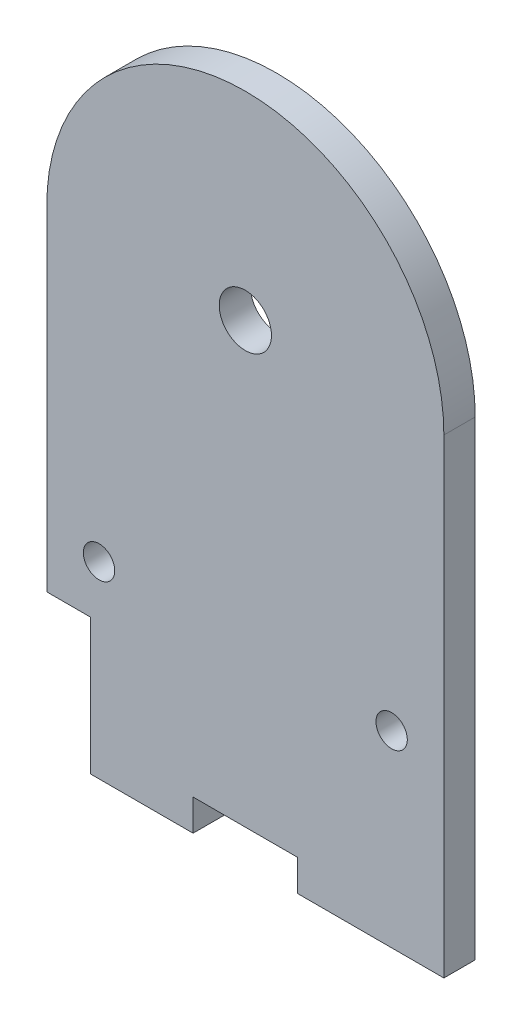
ISO-10303-21;
HEADER;
FILE_DESCRIPTION(('STEP AP214'),'2;1');
FILE_NAME('part.step','',(''),(''),'','','');
FILE_SCHEMA(('AUTOMOTIVE_DESIGN { 1 0 10303 214 1 1 1 1 }'));
ENDSEC;
DATA;
#1=APPLICATION_CONTEXT('core data for automotive mechanical design processes');
#2=APPLICATION_PROTOCOL_DEFINITION('international standard','automotive_design',2000,#1);
#3=PRODUCT_CONTEXT('',#1,'mechanical');
#4=PRODUCT('Part','Part','',(#3));
#5=PRODUCT_RELATED_PRODUCT_CATEGORY('part','',(#4));
#6=PRODUCT_DEFINITION_FORMATION('','',#4);
#7=PRODUCT_DEFINITION_CONTEXT('part definition',#1,'design');
#8=PRODUCT_DEFINITION('design','',#6,#7);
#9=PRODUCT_DEFINITION_SHAPE('','',#8);
#10=(LENGTH_UNIT() NAMED_UNIT(*) SI_UNIT(.MILLI.,.METRE.));
#11=(NAMED_UNIT(*) PLANE_ANGLE_UNIT() SI_UNIT($,.RADIAN.));
#12=(NAMED_UNIT(*) SI_UNIT($,.STERADIAN.) SOLID_ANGLE_UNIT());
#13=UNCERTAINTY_MEASURE_WITH_UNIT(LENGTH_MEASURE(1.E-05),#10,'distance_accuracy_value','');
#14=(GEOMETRIC_REPRESENTATION_CONTEXT(3) GLOBAL_UNCERTAINTY_ASSIGNED_CONTEXT((#13)) GLOBAL_UNIT_ASSIGNED_CONTEXT((#10,
#11,#12)) REPRESENTATION_CONTEXT('',''));
#15=CARTESIAN_POINT('',(0.,0.,0.));
#16=DIRECTION('',(0.,0.,1.));
#17=DIRECTION('',(1.,0.,0.));
#18=AXIS2_PLACEMENT_3D('',#15,#16,#17);
#19=CARTESIAN_POINT('',(0.,0.,3.));
#20=DIRECTION('',(0.,0.,1.));
#21=DIRECTION('',(1.,0.,0.));
#22=AXIS2_PLACEMENT_3D('',#19,#20,#21);
#23=PLANE('',#22);
#24=CARTESIAN_POINT('',(-14.,-27.,3.));
#25=DIRECTION('',(0.,0.,1.));
#26=DIRECTION('',(1.,0.,0.));
#27=AXIS2_PLACEMENT_3D('',#24,#25,#26);
#28=CIRCLE('',#27,1.5);
#29=CARTESIAN_POINT('',(-12.5,-27.,3.));
#30=VERTEX_POINT('',#29);
#31=EDGE_CURVE('E211',#30,#30,#28,.T.);
#32=ORIENTED_EDGE('',*,*,#31,.F.);
#33=EDGE_LOOP('',(#32));
#34=FACE_BOUND('',#33,.T.);
#35=CARTESIAN_POINT('',(0.,0.,3.));
#36=DIRECTION('',(0.,0.,1.));
#37=DIRECTION('',(1.,0.,0.));
#38=AXIS2_PLACEMENT_3D('',#35,#36,#37);
#39=CIRCLE('',#38,19.);
#40=CARTESIAN_POINT('',(19.,0.,3.));
#41=VERTEX_POINT('',#40);
#42=CARTESIAN_POINT('',(-19.,0.,3.));
#43=VERTEX_POINT('',#42);
#44=EDGE_CURVE('E160',#41,#43,#39,.T.);
#45=ORIENTED_EDGE('',*,*,#44,.T.);
#46=DIRECTION('',(0.,-1.,0.));
#47=VECTOR('',#46,1.);
#48=CARTESIAN_POINT('',(-19.,0.,3.));
#49=LINE('',#48,#47);
#50=CARTESIAN_POINT('',(-19.,-32.,3.));
#51=VERTEX_POINT('',#50);
#52=EDGE_CURVE('E98',#43,#51,#49,.T.);
#53=ORIENTED_EDGE('',*,*,#52,.T.);
#54=DIRECTION('',(1.,0.,0.));
#55=VECTOR('',#54,1.);
#56=CARTESIAN_POINT('',(-19.,-32.,3.));
#57=LINE('',#56,#55);
#58=CARTESIAN_POINT('',(-14.8,-32.,3.));
#59=VERTEX_POINT('',#58);
#60=EDGE_CURVE('E181',#51,#59,#57,.T.);
#61=ORIENTED_EDGE('',*,*,#60,.T.);
#62=DIRECTION('',(0.,-1.,0.));
#63=VECTOR('',#62,1.);
#64=CARTESIAN_POINT('',(-14.8,-32.,3.));
#65=LINE('',#64,#63);
#66=CARTESIAN_POINT('',(-14.8,-45.,3.));
#67=VERTEX_POINT('',#66);
#68=EDGE_CURVE('E200',#59,#67,#65,.T.);
#69=ORIENTED_EDGE('',*,*,#68,.T.);
#70=DIRECTION('',(1.,0.,0.));
#71=VECTOR('',#70,1.);
#72=CARTESIAN_POINT('',(-14.8,-45.,3.));
#73=LINE('',#72,#71);
#74=CARTESIAN_POINT('',(-4.99999999999999,-45.,3.));
#75=VERTEX_POINT('',#74);
#76=EDGE_CURVE('E197',#67,#75,#73,.T.);
#77=ORIENTED_EDGE('',*,*,#76,.T.);
#78=DIRECTION('',(0.,1.,0.));
#79=VECTOR('',#78,1.);
#80=CARTESIAN_POINT('',(-4.99999999999999,-42.,3.));
#81=LINE('',#80,#79);
#82=CARTESIAN_POINT('',(-4.99999999999999,-42.,3.));
#83=VERTEX_POINT('',#82);
#84=EDGE_CURVE('E199',#75,#83,#81,.T.);
#85=ORIENTED_EDGE('',*,*,#84,.T.);
#86=DIRECTION('',(1.,0.,0.));
#87=VECTOR('',#86,1.);
#88=CARTESIAN_POINT('',(5.,-42.,3.));
#89=LINE('',#88,#87);
#90=CARTESIAN_POINT('',(5.,-42.,3.));
#91=VERTEX_POINT('',#90);
#92=EDGE_CURVE('E123',#83,#91,#89,.T.);
#93=ORIENTED_EDGE('',*,*,#92,.T.);
#94=DIRECTION('',(0.,-1.,0.));
#95=VECTOR('',#94,1.);
#96=CARTESIAN_POINT('',(5.,-42.,3.));
#97=LINE('',#96,#95);
#98=CARTESIAN_POINT('',(5.,-45.,3.));
#99=VERTEX_POINT('',#98);
#100=EDGE_CURVE('E117',#91,#99,#97,.T.);
#101=ORIENTED_EDGE('',*,*,#100,.T.);
#102=DIRECTION('',(1.,0.,0.));
#103=VECTOR('',#102,1.);
#104=CARTESIAN_POINT('',(5.,-45.,3.));
#105=LINE('',#104,#103);
#106=CARTESIAN_POINT('',(19.,-45.,3.));
#107=VERTEX_POINT('',#106);
#108=EDGE_CURVE('E121',#99,#107,#105,.T.);
#109=ORIENTED_EDGE('',*,*,#108,.T.);
#110=DIRECTION('',(0.,1.,0.));
#111=VECTOR('',#110,1.);
#112=CARTESIAN_POINT('',(19.,-45.,3.));
#113=LINE('',#112,#111);
#114=EDGE_CURVE('E49',#107,#41,#113,.T.);
#115=ORIENTED_EDGE('',*,*,#114,.T.);
#116=EDGE_LOOP('',(#45,#53,#61,#69,#77,#85,#93,#101,#109,#115));
#117=FACE_BOUND('',#116,.T.);
#118=CARTESIAN_POINT('',(0.,0.,3.));
#119=DIRECTION('',(0.,0.,1.));
#120=DIRECTION('',(1.,0.,0.));
#121=AXIS2_PLACEMENT_3D('',#118,#119,#120);
#122=CIRCLE('',#121,2.5);
#123=CARTESIAN_POINT('',(2.5,0.,3.));
#124=VERTEX_POINT('',#123);
#125=EDGE_CURVE('E145',#124,#124,#122,.T.);
#126=ORIENTED_EDGE('',*,*,#125,.F.);
#127=EDGE_LOOP('',(#126));
#128=FACE_BOUND('',#127,.T.);
#129=CARTESIAN_POINT('',(14.,-27.,3.));
#130=DIRECTION('',(0.,0.,1.));
#131=DIRECTION('',(-1.,0.,0.));
#132=AXIS2_PLACEMENT_3D('',#129,#130,#131);
#133=CIRCLE('',#132,1.5);
#134=CARTESIAN_POINT('',(12.5,-27.,3.));
#135=VERTEX_POINT('',#134);
#136=EDGE_CURVE('E217',#135,#135,#133,.T.);
#137=ORIENTED_EDGE('',*,*,#136,.F.);
#138=EDGE_LOOP('',(#137));
#139=FACE_BOUND('',#138,.T.);
#140=ADVANCED_FACE('F32',(#34,#117,#128,#139),#23,.T.);
#141=CARTESIAN_POINT('',(0.,0.,0.));
#142=DIRECTION('',(0.,0.,1.));
#143=DIRECTION('',(1.,0.,0.));
#144=AXIS2_PLACEMENT_3D('',#141,#142,#143);
#145=PLANE('',#144);
#146=CARTESIAN_POINT('',(-14.,-27.,0.));
#147=DIRECTION('',(0.,0.,1.));
#148=DIRECTION('',(1.,0.,0.));
#149=AXIS2_PLACEMENT_3D('',#146,#147,#148);
#150=CIRCLE('',#149,1.5);
#151=CARTESIAN_POINT('',(-12.5,-27.,0.));
#152=VERTEX_POINT('',#151);
#153=EDGE_CURVE('E214',#152,#152,#150,.T.);
#154=ORIENTED_EDGE('',*,*,#153,.T.);
#155=EDGE_LOOP('',(#154));
#156=FACE_BOUND('',#155,.T.);
#157=CARTESIAN_POINT('',(0.,0.,0.));
#158=DIRECTION('',(0.,0.,1.));
#159=DIRECTION('',(1.,0.,0.));
#160=AXIS2_PLACEMENT_3D('',#157,#158,#159);
#161=CIRCLE('',#160,19.);
#162=CARTESIAN_POINT('',(19.,0.,0.));
#163=VERTEX_POINT('',#162);
#164=CARTESIAN_POINT('',(-19.,0.,0.));
#165=VERTEX_POINT('',#164);
#166=EDGE_CURVE('E141',#163,#165,#161,.T.);
#167=ORIENTED_EDGE('',*,*,#166,.F.);
#168=DIRECTION('',(0.,1.,0.));
#169=VECTOR('',#168,1.);
#170=CARTESIAN_POINT('',(19.,-45.,0.));
#171=LINE('',#170,#169);
#172=CARTESIAN_POINT('',(19.,-45.,0.));
#173=VERTEX_POINT('',#172);
#174=EDGE_CURVE('E90',#173,#163,#171,.T.);
#175=ORIENTED_EDGE('',*,*,#174,.F.);
#176=DIRECTION('',(1.,0.,0.));
#177=VECTOR('',#176,1.);
#178=CARTESIAN_POINT('',(5.,-45.,0.));
#179=LINE('',#178,#177);
#180=CARTESIAN_POINT('',(5.,-45.,0.));
#181=VERTEX_POINT('',#180);
#182=EDGE_CURVE('E84',#181,#173,#179,.T.);
#183=ORIENTED_EDGE('',*,*,#182,.F.);
#184=DIRECTION('',(0.,-1.,0.));
#185=VECTOR('',#184,1.);
#186=CARTESIAN_POINT('',(5.,-42.,0.));
#187=LINE('',#186,#185);
#188=CARTESIAN_POINT('',(5.,-42.,0.));
#189=VERTEX_POINT('',#188);
#190=EDGE_CURVE('E131',#189,#181,#187,.T.);
#191=ORIENTED_EDGE('',*,*,#190,.F.);
#192=DIRECTION('',(1.,0.,0.));
#193=VECTOR('',#192,1.);
#194=CARTESIAN_POINT('',(5.,-42.,0.));
#195=LINE('',#194,#193);
#196=CARTESIAN_POINT('',(-4.99999999999999,-42.,0.));
#197=VERTEX_POINT('',#196);
#198=EDGE_CURVE('E155',#197,#189,#195,.T.);
#199=ORIENTED_EDGE('',*,*,#198,.F.);
#200=DIRECTION('',(0.,1.,0.));
#201=VECTOR('',#200,1.);
#202=CARTESIAN_POINT('',(-4.99999999999999,-42.,0.));
#203=LINE('',#202,#201);
#204=CARTESIAN_POINT('',(-4.99999999999999,-45.,0.));
#205=VERTEX_POINT('',#204);
#206=EDGE_CURVE('E153',#205,#197,#203,.T.);
#207=ORIENTED_EDGE('',*,*,#206,.F.);
#208=DIRECTION('',(1.,0.,0.));
#209=VECTOR('',#208,1.);
#210=CARTESIAN_POINT('',(-14.8,-45.,0.));
#211=LINE('',#210,#209);
#212=CARTESIAN_POINT('',(-14.8,-45.,0.));
#213=VERTEX_POINT('',#212);
#214=EDGE_CURVE('E151',#213,#205,#211,.T.);
#215=ORIENTED_EDGE('',*,*,#214,.F.);
#216=DIRECTION('',(0.,-1.,0.));
#217=VECTOR('',#216,1.);
#218=CARTESIAN_POINT('',(-14.8,-32.,0.));
#219=LINE('',#218,#217);
#220=CARTESIAN_POINT('',(-14.8,-32.,0.));
#221=VERTEX_POINT('',#220);
#222=EDGE_CURVE('E149',#221,#213,#219,.T.);
#223=ORIENTED_EDGE('',*,*,#222,.F.);
#224=DIRECTION('',(1.,0.,0.));
#225=VECTOR('',#224,1.);
#226=CARTESIAN_POINT('',(-19.,-32.,0.));
#227=LINE('',#226,#225);
#228=CARTESIAN_POINT('',(-19.,-32.,0.));
#229=VERTEX_POINT('',#228);
#230=EDGE_CURVE('E147',#229,#221,#227,.T.);
#231=ORIENTED_EDGE('',*,*,#230,.F.);
#232=DIRECTION('',(0.,-1.,0.));
#233=VECTOR('',#232,1.);
#234=CARTESIAN_POINT('',(-19.,0.,0.));
#235=LINE('',#234,#233);
#236=EDGE_CURVE('E144',#165,#229,#235,.T.);
#237=ORIENTED_EDGE('',*,*,#236,.F.);
#238=EDGE_LOOP('',(#167,#175,#183,#191,#199,#207,#215,#223,#231,#237));
#239=FACE_BOUND('',#238,.T.);
#240=CARTESIAN_POINT('',(0.,0.,0.));
#241=DIRECTION('',(0.,0.,1.));
#242=DIRECTION('',(1.,0.,0.));
#243=AXIS2_PLACEMENT_3D('',#240,#241,#242);
#244=CIRCLE('',#243,2.5);
#245=CARTESIAN_POINT('',(2.5,0.,0.));
#246=VERTEX_POINT('',#245);
#247=EDGE_CURVE('E208',#246,#246,#244,.T.);
#248=ORIENTED_EDGE('',*,*,#247,.T.);
#249=EDGE_LOOP('',(#248));
#250=FACE_BOUND('',#249,.T.);
#251=CARTESIAN_POINT('',(14.,-27.,0.));
#252=DIRECTION('',(0.,0.,1.));
#253=DIRECTION('',(-1.,0.,0.));
#254=AXIS2_PLACEMENT_3D('',#251,#252,#253);
#255=CIRCLE('',#254,1.5);
#256=CARTESIAN_POINT('',(12.5,-27.,0.));
#257=VERTEX_POINT('',#256);
#258=EDGE_CURVE('E220',#257,#257,#255,.T.);
#259=ORIENTED_EDGE('',*,*,#258,.T.);
#260=EDGE_LOOP('',(#259));
#261=FACE_BOUND('',#260,.T.);
#262=ADVANCED_FACE('F185',(#156,#239,#250,#261),#145,.F.);
#263=CARTESIAN_POINT('',(0.,0.,3.));
#264=DIRECTION('',(0.,0.,-1.));
#265=DIRECTION('',(-1.,0.,0.));
#266=AXIS2_PLACEMENT_3D('',#263,#264,#265);
#267=CYLINDRICAL_SURFACE('',#266,19.);
#268=ORIENTED_EDGE('',*,*,#166,.T.);
#269=DIRECTION('',(0.,0.,-1.));
#270=VECTOR('',#269,1.);
#271=CARTESIAN_POINT('',(-19.,0.,3.));
#272=LINE('',#271,#270);
#273=EDGE_CURVE('E11',#43,#165,#272,.T.);
#274=ORIENTED_EDGE('',*,*,#273,.F.);
#275=ORIENTED_EDGE('',*,*,#44,.F.);
#276=DIRECTION('',(0.,0.,-1.));
#277=VECTOR('',#276,1.);
#278=CARTESIAN_POINT('',(19.,0.,3.));
#279=LINE('',#278,#277);
#280=EDGE_CURVE('E137',#41,#163,#279,.T.);
#281=ORIENTED_EDGE('',*,*,#280,.T.);
#282=EDGE_LOOP('',(#268,#274,#275,#281));
#283=FACE_BOUND('',#282,.T.);
#284=ADVANCED_FACE('F34',(#283),#267,.T.);
#285=CARTESIAN_POINT('',(-19.,0.,3.));
#286=DIRECTION('',(1.,0.,0.));
#287=DIRECTION('',(0.,1.,0.));
#288=AXIS2_PLACEMENT_3D('',#285,#286,#287);
#289=PLANE('',#288);
#290=ORIENTED_EDGE('',*,*,#236,.T.);
#291=DIRECTION('',(0.,0.,-1.));
#292=VECTOR('',#291,1.);
#293=CARTESIAN_POINT('',(-19.,-32.,3.));
#294=LINE('',#293,#292);
#295=EDGE_CURVE('E41',#51,#229,#294,.T.);
#296=ORIENTED_EDGE('',*,*,#295,.F.);
#297=ORIENTED_EDGE('',*,*,#52,.F.);
#298=ORIENTED_EDGE('',*,*,#273,.T.);
#299=EDGE_LOOP('',(#290,#296,#297,#298));
#300=FACE_BOUND('',#299,.T.);
#301=ADVANCED_FACE('F262',(#300),#289,.F.);
#302=CARTESIAN_POINT('',(-19.,-32.,3.));
#303=DIRECTION('',(0.,1.,0.));
#304=DIRECTION('',(-1.,0.,0.));
#305=AXIS2_PLACEMENT_3D('',#302,#303,#304);
#306=PLANE('',#305);
#307=ORIENTED_EDGE('',*,*,#230,.T.);
#308=DIRECTION('',(0.,0.,-1.));
#309=VECTOR('',#308,1.);
#310=CARTESIAN_POINT('',(-14.8,-32.,3.));
#311=LINE('',#310,#309);
#312=EDGE_CURVE('E173',#59,#221,#311,.T.);
#313=ORIENTED_EDGE('',*,*,#312,.F.);
#314=ORIENTED_EDGE('',*,*,#60,.F.);
#315=ORIENTED_EDGE('',*,*,#295,.T.);
#316=EDGE_LOOP('',(#307,#313,#314,#315));
#317=FACE_BOUND('',#316,.T.);
#318=ADVANCED_FACE('F179',(#317),#306,.F.);
#319=CARTESIAN_POINT('',(-14.8,-32.,3.));
#320=DIRECTION('',(1.,0.,0.));
#321=DIRECTION('',(0.,0.,-1.));
#322=AXIS2_PLACEMENT_3D('',#319,#320,#321);
#323=PLANE('',#322);
#324=ORIENTED_EDGE('',*,*,#222,.T.);
#325=DIRECTION('',(0.,0.,-1.));
#326=VECTOR('',#325,1.);
#327=CARTESIAN_POINT('',(-14.8,-45.,3.));
#328=LINE('',#327,#326);
#329=EDGE_CURVE('E170',#67,#213,#328,.T.);
#330=ORIENTED_EDGE('',*,*,#329,.F.);
#331=ORIENTED_EDGE('',*,*,#68,.F.);
#332=ORIENTED_EDGE('',*,*,#312,.T.);
#333=EDGE_LOOP('',(#324,#330,#331,#332));
#334=FACE_BOUND('',#333,.T.);
#335=ADVANCED_FACE('F191',(#334),#323,.F.);
#336=CARTESIAN_POINT('',(-14.8,-45.,3.));
#337=DIRECTION('',(0.,1.,0.));
#338=DIRECTION('',(0.,0.,1.));
#339=AXIS2_PLACEMENT_3D('',#336,#337,#338);
#340=PLANE('',#339);
#341=ORIENTED_EDGE('',*,*,#214,.T.);
#342=DIRECTION('',(0.,0.,-1.));
#343=VECTOR('',#342,1.);
#344=CARTESIAN_POINT('',(-4.99999999999999,-45.,3.));
#345=LINE('',#344,#343);
#346=EDGE_CURVE('E167',#75,#205,#345,.T.);
#347=ORIENTED_EDGE('',*,*,#346,.F.);
#348=ORIENTED_EDGE('',*,*,#76,.F.);
#349=ORIENTED_EDGE('',*,*,#329,.T.);
#350=EDGE_LOOP('',(#341,#347,#348,#349));
#351=FACE_BOUND('',#350,.T.);
#352=ADVANCED_FACE('F195',(#351),#340,.F.);
#353=CARTESIAN_POINT('',(-4.99999999999999,-42.,3.));
#354=DIRECTION('',(-1.,0.,0.));
#355=DIRECTION('',(0.,0.,1.));
#356=AXIS2_PLACEMENT_3D('',#353,#354,#355);
#357=PLANE('',#356);
#358=ORIENTED_EDGE('',*,*,#206,.T.);
#359=DIRECTION('',(0.,0.,-1.));
#360=VECTOR('',#359,1.);
#361=CARTESIAN_POINT('',(-4.99999999999999,-42.,3.));
#362=LINE('',#361,#360);
#363=EDGE_CURVE('E164',#83,#197,#362,.T.);
#364=ORIENTED_EDGE('',*,*,#363,.F.);
#365=ORIENTED_EDGE('',*,*,#84,.F.);
#366=ORIENTED_EDGE('',*,*,#346,.T.);
#367=EDGE_LOOP('',(#358,#364,#365,#366));
#368=FACE_BOUND('',#367,.T.);
#369=ADVANCED_FACE('F252',(#368),#357,.F.);
#370=CARTESIAN_POINT('',(5.,-42.,3.));
#371=DIRECTION('',(0.,1.,0.));
#372=DIRECTION('',(0.,0.,1.));
#373=AXIS2_PLACEMENT_3D('',#370,#371,#372);
#374=PLANE('',#373);
#375=ORIENTED_EDGE('',*,*,#198,.T.);
#376=DIRECTION('',(0.,0.,-1.));
#377=VECTOR('',#376,1.);
#378=CARTESIAN_POINT('',(5.,-42.,3.));
#379=LINE('',#378,#377);
#380=EDGE_CURVE('E132',#91,#189,#379,.T.);
#381=ORIENTED_EDGE('',*,*,#380,.F.);
#382=ORIENTED_EDGE('',*,*,#92,.F.);
#383=ORIENTED_EDGE('',*,*,#363,.T.);
#384=EDGE_LOOP('',(#375,#381,#382,#383));
#385=FACE_BOUND('',#384,.T.);
#386=ADVANCED_FACE('F249',(#385),#374,.F.);
#387=CARTESIAN_POINT('',(5.,-42.,3.));
#388=DIRECTION('',(1.,0.,0.));
#389=DIRECTION('',(0.,0.,-1.));
#390=AXIS2_PLACEMENT_3D('',#387,#388,#389);
#391=PLANE('',#390);
#392=ORIENTED_EDGE('',*,*,#190,.T.);
#393=DIRECTION('',(0.,0.,-1.));
#394=VECTOR('',#393,1.);
#395=CARTESIAN_POINT('',(5.,-45.,3.));
#396=LINE('',#395,#394);
#397=EDGE_CURVE('E128',#99,#181,#396,.T.);
#398=ORIENTED_EDGE('',*,*,#397,.F.);
#399=ORIENTED_EDGE('',*,*,#100,.F.);
#400=ORIENTED_EDGE('',*,*,#380,.T.);
#401=EDGE_LOOP('',(#392,#398,#399,#400));
#402=FACE_BOUND('',#401,.T.);
#403=ADVANCED_FACE('F129',(#402),#391,.F.);
#404=CARTESIAN_POINT('',(5.,-45.,3.));
#405=DIRECTION('',(0.,1.,0.));
#406=DIRECTION('',(-1.,0.,0.));
#407=AXIS2_PLACEMENT_3D('',#404,#405,#406);
#408=PLANE('',#407);
#409=ORIENTED_EDGE('',*,*,#182,.T.);
#410=DIRECTION('',(0.,0.,-1.));
#411=VECTOR('',#410,1.);
#412=CARTESIAN_POINT('',(19.,-45.,3.));
#413=LINE('',#412,#411);
#414=EDGE_CURVE('E133',#107,#173,#413,.T.);
#415=ORIENTED_EDGE('',*,*,#414,.F.);
#416=ORIENTED_EDGE('',*,*,#108,.F.);
#417=ORIENTED_EDGE('',*,*,#397,.T.);
#418=EDGE_LOOP('',(#409,#415,#416,#417));
#419=FACE_BOUND('',#418,.T.);
#420=ADVANCED_FACE('F135',(#419),#408,.F.);
#421=CARTESIAN_POINT('',(19.,-45.,3.));
#422=DIRECTION('',(-1.,0.,0.));
#423=DIRECTION('',(0.,0.,1.));
#424=AXIS2_PLACEMENT_3D('',#421,#422,#423);
#425=PLANE('',#424);
#426=ORIENTED_EDGE('',*,*,#174,.T.);
#427=ORIENTED_EDGE('',*,*,#280,.F.);
#428=ORIENTED_EDGE('',*,*,#114,.F.);
#429=ORIENTED_EDGE('',*,*,#414,.T.);
#430=EDGE_LOOP('',(#426,#427,#428,#429));
#431=FACE_BOUND('',#430,.T.);
#432=ADVANCED_FACE('F242',(#431),#425,.F.);
#433=CARTESIAN_POINT('',(0.,0.,3.));
#434=DIRECTION('',(0.,0.,-1.));
#435=DIRECTION('',(-1.,0.,0.));
#436=AXIS2_PLACEMENT_3D('',#433,#434,#435);
#437=CYLINDRICAL_SURFACE('',#436,2.5);
#438=ORIENTED_EDGE('',*,*,#125,.T.);
#439=EDGE_LOOP('',(#438));
#440=FACE_BOUND('',#439,.T.);
#441=ORIENTED_EDGE('',*,*,#247,.F.);
#442=EDGE_LOOP('',(#441));
#443=FACE_BOUND('',#442,.T.);
#444=ADVANCED_FACE('F239',(#440,#443),#437,.F.);
#445=CARTESIAN_POINT('',(-14.,-27.,3.));
#446=DIRECTION('',(0.,0.,-1.));
#447=DIRECTION('',(-1.,0.,0.));
#448=AXIS2_PLACEMENT_3D('',#445,#446,#447);
#449=CYLINDRICAL_SURFACE('',#448,1.5);
#450=ORIENTED_EDGE('',*,*,#31,.T.);
#451=EDGE_LOOP('',(#450));
#452=FACE_BOUND('',#451,.T.);
#453=ORIENTED_EDGE('',*,*,#153,.F.);
#454=EDGE_LOOP('',(#453));
#455=FACE_BOUND('',#454,.T.);
#456=ADVANCED_FACE('F338',(#452,#455),#449,.F.);
#457=CARTESIAN_POINT('',(14.,-27.,3.));
#458=DIRECTION('',(0.,0.,-1.));
#459=DIRECTION('',(-1.,0.,0.));
#460=AXIS2_PLACEMENT_3D('',#457,#458,#459);
#461=CYLINDRICAL_SURFACE('',#460,1.5);
#462=ORIENTED_EDGE('',*,*,#136,.T.);
#463=EDGE_LOOP('',(#462));
#464=FACE_BOUND('',#463,.T.);
#465=ORIENTED_EDGE('',*,*,#258,.F.);
#466=EDGE_LOOP('',(#465));
#467=FACE_BOUND('',#466,.T.);
#468=ADVANCED_FACE('F226',(#464,#467),#461,.F.);
#469=CLOSED_SHELL('',(#140,#262,#284,#301,#318,#335,#352,#369,#386,#403,#420,#432,#444,#456,#468));
#470=MANIFOLD_SOLID_BREP('B2',#469);
#471=ADVANCED_BREP_SHAPE_REPRESENTATION('',(#18,#470),#14);
#472=SHAPE_DEFINITION_REPRESENTATION(#9,#471);
ENDSEC;
END-ISO-10303-21;
